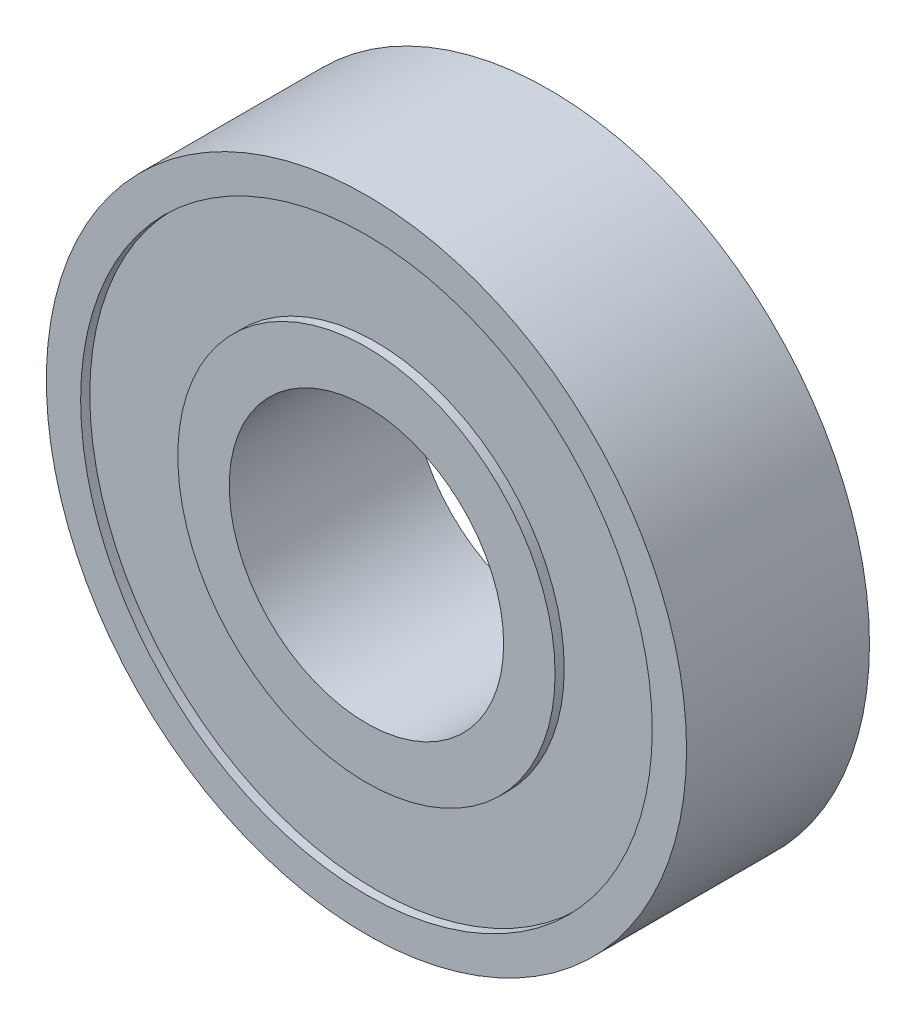
ISO-10303-21;
HEADER;
FILE_DESCRIPTION(('STEP AP214'),'2;1');
FILE_NAME('part.step','',(''),(''),'','','');
FILE_SCHEMA(('AUTOMOTIVE_DESIGN { 1 0 10303 214 1 1 1 1 }'));
ENDSEC;
DATA;
#1=APPLICATION_CONTEXT('core data for automotive mechanical design processes');
#2=APPLICATION_PROTOCOL_DEFINITION('international standard','automotive_design',2000,#1);
#3=PRODUCT_CONTEXT('',#1,'mechanical');
#4=PRODUCT('Part','Part','',(#3));
#5=PRODUCT_RELATED_PRODUCT_CATEGORY('part','',(#4));
#6=PRODUCT_DEFINITION_FORMATION('','',#4);
#7=PRODUCT_DEFINITION_CONTEXT('part definition',#1,'design');
#8=PRODUCT_DEFINITION('design','',#6,#7);
#9=PRODUCT_DEFINITION_SHAPE('','',#8);
#10=(LENGTH_UNIT() NAMED_UNIT(*) SI_UNIT(.MILLI.,.METRE.));
#11=(NAMED_UNIT(*) PLANE_ANGLE_UNIT() SI_UNIT($,.RADIAN.));
#12=(NAMED_UNIT(*) SI_UNIT($,.STERADIAN.) SOLID_ANGLE_UNIT());
#13=UNCERTAINTY_MEASURE_WITH_UNIT(LENGTH_MEASURE(1.E-05),#10,'distance_accuracy_value','');
#14=(GEOMETRIC_REPRESENTATION_CONTEXT(3) GLOBAL_UNCERTAINTY_ASSIGNED_CONTEXT((#13)) GLOBAL_UNIT_ASSIGNED_CONTEXT((#10,
#11,#12)) REPRESENTATION_CONTEXT('',''));
#15=CARTESIAN_POINT('',(0.,0.,0.));
#16=DIRECTION('',(0.,0.,1.));
#17=DIRECTION('',(1.,0.,0.));
#18=AXIS2_PLACEMENT_3D('',#15,#16,#17);
#19=CARTESIAN_POINT('',(0.,0.,-4.));
#20=DIRECTION('',(0.,0.,1.));
#21=DIRECTION('',(1.,0.,0.));
#22=AXIS2_PLACEMENT_3D('',#19,#20,#21);
#23=PLANE('',#22);
#24=CARTESIAN_POINT('',(0.,0.,-4.));
#25=DIRECTION('',(0.,0.,1.));
#26=DIRECTION('',(1.,0.,0.));
#27=AXIS2_PLACEMENT_3D('',#24,#25,#26);
#28=CIRCLE('',#27,14.);
#29=CARTESIAN_POINT('',(14.,0.,-4.));
#30=VERTEX_POINT('',#29);
#31=EDGE_CURVE('E32',#30,#30,#28,.T.);
#32=ORIENTED_EDGE('',*,*,#31,.F.);
#33=EDGE_LOOP('',(#32));
#34=FACE_BOUND('',#33,.T.);
#35=CARTESIAN_POINT('',(0.,0.,-4.));
#36=DIRECTION('',(0.,0.,1.));
#37=DIRECTION('',(1.,0.,0.));
#38=AXIS2_PLACEMENT_3D('',#35,#36,#37);
#39=CIRCLE('',#38,12.5);
#40=CARTESIAN_POINT('',(12.5,0.,-4.));
#41=VERTEX_POINT('',#40);
#42=EDGE_CURVE('E59',#41,#41,#39,.T.);
#43=ORIENTED_EDGE('',*,*,#42,.T.);
#44=EDGE_LOOP('',(#43));
#45=FACE_BOUND('',#44,.T.);
#46=ADVANCED_FACE('F28',(#34,#45),#23,.F.);
#47=CARTESIAN_POINT('',(0.,0.,4.));
#48=DIRECTION('',(0.,0.,1.));
#49=DIRECTION('',(1.,0.,0.));
#50=AXIS2_PLACEMENT_3D('',#47,#48,#49);
#51=PLANE('',#50);
#52=CARTESIAN_POINT('',(0.,0.,4.));
#53=DIRECTION('',(0.,0.,1.));
#54=DIRECTION('',(1.,0.,0.));
#55=AXIS2_PLACEMENT_3D('',#52,#53,#54);
#56=CIRCLE('',#55,6.);
#57=CARTESIAN_POINT('',(6.,0.,4.));
#58=VERTEX_POINT('',#57);
#59=EDGE_CURVE('E39',#58,#58,#56,.T.);
#60=ORIENTED_EDGE('',*,*,#59,.F.);
#61=EDGE_LOOP('',(#60));
#62=FACE_BOUND('',#61,.T.);
#63=CARTESIAN_POINT('',(0.,0.,4.));
#64=DIRECTION('',(0.,0.,1.));
#65=DIRECTION('',(1.,0.,0.));
#66=AXIS2_PLACEMENT_3D('',#63,#64,#65);
#67=CIRCLE('',#66,8.25);
#68=CARTESIAN_POINT('',(8.25,0.,4.));
#69=VERTEX_POINT('',#68);
#70=EDGE_CURVE('E53',#69,#69,#67,.T.);
#71=ORIENTED_EDGE('',*,*,#70,.T.);
#72=EDGE_LOOP('',(#71));
#73=FACE_BOUND('',#72,.T.);
#74=ADVANCED_FACE('F101',(#62,#73),#51,.T.);
#75=CARTESIAN_POINT('',(0.,0.,4.));
#76=DIRECTION('',(0.,0.,1.));
#77=DIRECTION('',(1.,0.,0.));
#78=AXIS2_PLACEMENT_3D('',#75,#76,#77);
#79=CIRCLE('',#78,12.5);
#80=CARTESIAN_POINT('',(12.5,0.,4.));
#81=VERTEX_POINT('',#80);
#82=EDGE_CURVE('E47',#81,#81,#79,.T.);
#83=ORIENTED_EDGE('',*,*,#82,.F.);
#84=EDGE_LOOP('',(#83));
#85=FACE_BOUND('',#84,.T.);
#86=CARTESIAN_POINT('',(0.,0.,4.));
#87=DIRECTION('',(0.,0.,1.));
#88=DIRECTION('',(1.,0.,0.));
#89=AXIS2_PLACEMENT_3D('',#86,#87,#88);
#90=CIRCLE('',#89,14.);
#91=CARTESIAN_POINT('',(14.,0.,4.));
#92=VERTEX_POINT('',#91);
#93=EDGE_CURVE('E10',#92,#92,#90,.T.);
#94=ORIENTED_EDGE('',*,*,#93,.T.);
#95=EDGE_LOOP('',(#94));
#96=FACE_BOUND('',#95,.T.);
#97=ADVANCED_FACE('F83',(#85,#96),#51,.T.);
#98=CARTESIAN_POINT('',(0.,0.,-4.));
#99=DIRECTION('',(0.,0.,1.));
#100=DIRECTION('',(1.,0.,0.));
#101=AXIS2_PLACEMENT_3D('',#98,#99,#100);
#102=CIRCLE('',#101,8.25);
#103=CARTESIAN_POINT('',(8.25,0.,-4.));
#104=VERTEX_POINT('',#103);
#105=EDGE_CURVE('E65',#104,#104,#102,.T.);
#106=ORIENTED_EDGE('',*,*,#105,.F.);
#107=EDGE_LOOP('',(#106));
#108=FACE_BOUND('',#107,.T.);
#109=CARTESIAN_POINT('',(0.,0.,-4.));
#110=DIRECTION('',(0.,0.,1.));
#111=DIRECTION('',(1.,0.,0.));
#112=AXIS2_PLACEMENT_3D('',#109,#110,#111);
#113=CIRCLE('',#112,6.);
#114=CARTESIAN_POINT('',(6.,0.,-4.));
#115=VERTEX_POINT('',#114);
#116=EDGE_CURVE('E41',#115,#115,#113,.T.);
#117=ORIENTED_EDGE('',*,*,#116,.T.);
#118=EDGE_LOOP('',(#117));
#119=FACE_BOUND('',#118,.T.);
#120=ADVANCED_FACE('F80',(#108,#119),#23,.F.);
#121=CARTESIAN_POINT('',(0.,0.,4.));
#122=DIRECTION('',(0.,0.,-1.));
#123=DIRECTION('',(-1.,0.,0.));
#124=AXIS2_PLACEMENT_3D('',#121,#122,#123);
#125=CYLINDRICAL_SURFACE('',#124,14.);
#126=ORIENTED_EDGE('',*,*,#93,.F.);
#127=EDGE_LOOP('',(#126));
#128=FACE_BOUND('',#127,.T.);
#129=ORIENTED_EDGE('',*,*,#31,.T.);
#130=EDGE_LOOP('',(#129));
#131=FACE_BOUND('',#130,.T.);
#132=ADVANCED_FACE('F30',(#128,#131),#125,.T.);
#133=CARTESIAN_POINT('',(0.,0.,4.));
#134=DIRECTION('',(0.,0.,-1.));
#135=DIRECTION('',(-1.,0.,0.));
#136=AXIS2_PLACEMENT_3D('',#133,#134,#135);
#137=CYLINDRICAL_SURFACE('',#136,6.);
#138=ORIENTED_EDGE('',*,*,#59,.T.);
#139=EDGE_LOOP('',(#138));
#140=FACE_BOUND('',#139,.T.);
#141=ORIENTED_EDGE('',*,*,#116,.F.);
#142=EDGE_LOOP('',(#141));
#143=FACE_BOUND('',#142,.T.);
#144=ADVANCED_FACE('F86',(#140,#143),#137,.F.);
#145=CARTESIAN_POINT('',(0.,0.,3.6));
#146=DIRECTION('',(0.,0.,1.));
#147=DIRECTION('',(1.,0.,0.));
#148=AXIS2_PLACEMENT_3D('',#145,#146,#147);
#149=CYLINDRICAL_SURFACE('',#148,12.5);
#150=CARTESIAN_POINT('',(0.,0.,3.6));
#151=DIRECTION('',(0.,0.,1.));
#152=DIRECTION('',(1.,0.,0.));
#153=AXIS2_PLACEMENT_3D('',#150,#151,#152);
#154=CIRCLE('',#153,12.5);
#155=CARTESIAN_POINT('',(12.5,0.,3.6));
#156=VERTEX_POINT('',#155);
#157=EDGE_CURVE('E44',#156,#156,#154,.T.);
#158=ORIENTED_EDGE('',*,*,#157,.F.);
#159=EDGE_LOOP('',(#158));
#160=FACE_BOUND('',#159,.T.);
#161=ORIENTED_EDGE('',*,*,#82,.T.);
#162=EDGE_LOOP('',(#161));
#163=FACE_BOUND('',#162,.T.);
#164=ADVANCED_FACE('F88',(#160,#163),#149,.F.);
#165=CARTESIAN_POINT('',(0.,0.,3.6));
#166=DIRECTION('',(0.,0.,1.));
#167=DIRECTION('',(1.,0.,0.));
#168=AXIS2_PLACEMENT_3D('',#165,#166,#167);
#169=PLANE('',#168);
#170=CARTESIAN_POINT('',(0.,0.,3.6));
#171=DIRECTION('',(0.,0.,1.));
#172=DIRECTION('',(1.,0.,0.));
#173=AXIS2_PLACEMENT_3D('',#170,#171,#172);
#174=CIRCLE('',#173,8.25);
#175=CARTESIAN_POINT('',(8.25,0.,3.6));
#176=VERTEX_POINT('',#175);
#177=EDGE_CURVE('E50',#176,#176,#174,.T.);
#178=ORIENTED_EDGE('',*,*,#177,.F.);
#179=EDGE_LOOP('',(#178));
#180=FACE_BOUND('',#179,.T.);
#181=ORIENTED_EDGE('',*,*,#157,.T.);
#182=EDGE_LOOP('',(#181));
#183=FACE_BOUND('',#182,.T.);
#184=ADVANCED_FACE('F95',(#180,#183),#169,.T.);
#185=CARTESIAN_POINT('',(0.,0.,3.6));
#186=DIRECTION('',(0.,0.,1.));
#187=DIRECTION('',(1.,0.,0.));
#188=AXIS2_PLACEMENT_3D('',#185,#186,#187);
#189=CYLINDRICAL_SURFACE('',#188,8.25);
#190=ORIENTED_EDGE('',*,*,#177,.T.);
#191=EDGE_LOOP('',(#190));
#192=FACE_BOUND('',#191,.T.);
#193=ORIENTED_EDGE('',*,*,#70,.F.);
#194=EDGE_LOOP('',(#193));
#195=FACE_BOUND('',#194,.T.);
#196=ADVANCED_FACE('F149',(#192,#195),#189,.T.);
#197=CARTESIAN_POINT('',(0.,0.,-3.6));
#198=DIRECTION('',(0.,0.,-1.));
#199=DIRECTION('',(1.,0.,0.));
#200=AXIS2_PLACEMENT_3D('',#197,#198,#199);
#201=PLANE('',#200);
#202=CARTESIAN_POINT('',(0.,0.,-3.6));
#203=DIRECTION('',(0.,0.,1.));
#204=DIRECTION('',(1.,0.,0.));
#205=AXIS2_PLACEMENT_3D('',#202,#203,#204);
#206=CIRCLE('',#205,12.5);
#207=CARTESIAN_POINT('',(12.5,0.,-3.6));
#208=VERTEX_POINT('',#207);
#209=EDGE_CURVE('E56',#208,#208,#206,.T.);
#210=ORIENTED_EDGE('',*,*,#209,.F.);
#211=EDGE_LOOP('',(#210));
#212=FACE_BOUND('',#211,.T.);
#213=CARTESIAN_POINT('',(0.,0.,-3.6));
#214=DIRECTION('',(0.,0.,1.));
#215=DIRECTION('',(1.,0.,0.));
#216=AXIS2_PLACEMENT_3D('',#213,#214,#215);
#217=CIRCLE('',#216,8.25);
#218=CARTESIAN_POINT('',(8.25,0.,-3.6));
#219=VERTEX_POINT('',#218);
#220=EDGE_CURVE('E62',#219,#219,#217,.T.);
#221=ORIENTED_EDGE('',*,*,#220,.T.);
#222=EDGE_LOOP('',(#221));
#223=FACE_BOUND('',#222,.T.);
#224=ADVANCED_FACE('F71',(#212,#223),#201,.T.);
#225=CARTESIAN_POINT('',(0.,0.,-3.6));
#226=DIRECTION('',(0.,0.,-1.));
#227=DIRECTION('',(-1.,0.,0.));
#228=AXIS2_PLACEMENT_3D('',#225,#226,#227);
#229=CYLINDRICAL_SURFACE('',#228,12.5);
#230=ORIENTED_EDGE('',*,*,#209,.T.);
#231=EDGE_LOOP('',(#230));
#232=FACE_BOUND('',#231,.T.);
#233=ORIENTED_EDGE('',*,*,#42,.F.);
#234=EDGE_LOOP('',(#233));
#235=FACE_BOUND('',#234,.T.);
#236=ADVANCED_FACE('F76',(#232,#235),#229,.F.);
#237=CARTESIAN_POINT('',(0.,0.,-3.6));
#238=DIRECTION('',(0.,0.,-1.));
#239=DIRECTION('',(-1.,0.,0.));
#240=AXIS2_PLACEMENT_3D('',#237,#238,#239);
#241=CYLINDRICAL_SURFACE('',#240,8.25);
#242=ORIENTED_EDGE('',*,*,#220,.F.);
#243=EDGE_LOOP('',(#242));
#244=FACE_BOUND('',#243,.T.);
#245=ORIENTED_EDGE('',*,*,#105,.T.);
#246=EDGE_LOOP('',(#245));
#247=FACE_BOUND('',#246,.T.);
#248=ADVANCED_FACE('F73',(#244,#247),#241,.T.);
#249=CLOSED_SHELL('',(#46,#74,#97,#120,#132,#144,#164,#184,#196,#224,#236,#248));
#250=MANIFOLD_SOLID_BREP('B2',#249);
#251=ADVANCED_BREP_SHAPE_REPRESENTATION('',(#18,#250),#14);
#252=SHAPE_DEFINITION_REPRESENTATION(#9,#251);
ENDSEC;
END-ISO-10303-21;
